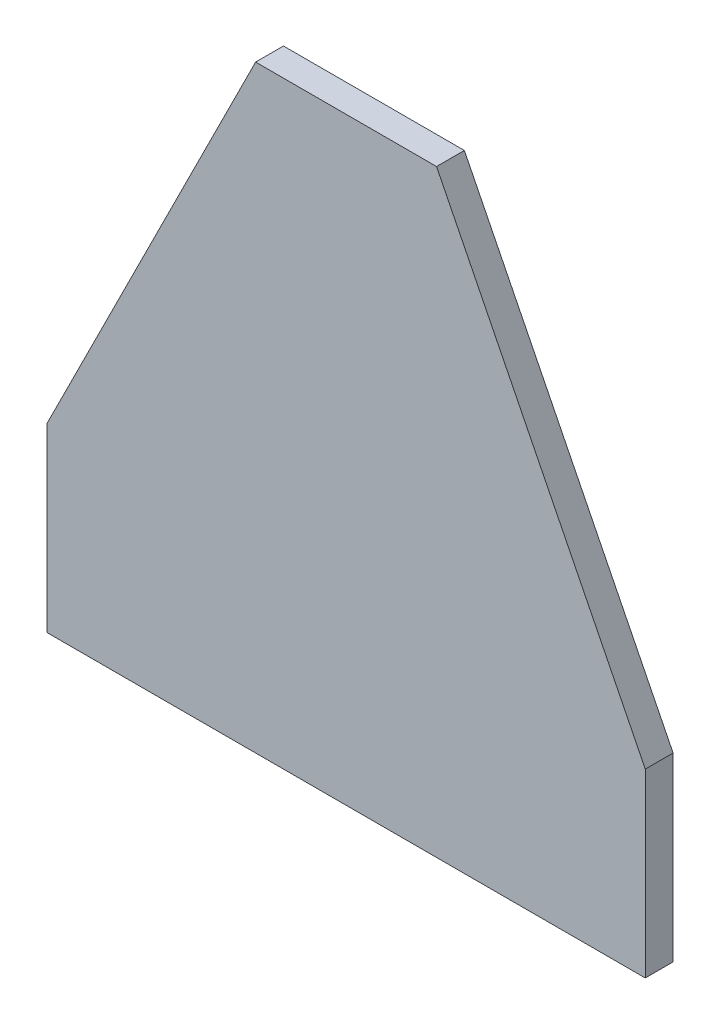
ISO-10303-21;
HEADER;
FILE_DESCRIPTION(('STEP AP214'),'2;1');
FILE_NAME('part.step','',(''),(''),'','','');
FILE_SCHEMA(('AUTOMOTIVE_DESIGN { 1 0 10303 214 1 1 1 1 }'));
ENDSEC;
DATA;
#1=APPLICATION_CONTEXT('core data for automotive mechanical design processes');
#2=APPLICATION_PROTOCOL_DEFINITION('international standard','automotive_design',2000,#1);
#3=PRODUCT_CONTEXT('',#1,'mechanical');
#4=PRODUCT('Part','Part','',(#3));
#5=PRODUCT_RELATED_PRODUCT_CATEGORY('part','',(#4));
#6=PRODUCT_DEFINITION_FORMATION('','',#4);
#7=PRODUCT_DEFINITION_CONTEXT('part definition',#1,'design');
#8=PRODUCT_DEFINITION('design','',#6,#7);
#9=PRODUCT_DEFINITION_SHAPE('','',#8);
#10=(LENGTH_UNIT() NAMED_UNIT(*) SI_UNIT(.MILLI.,.METRE.));
#11=(NAMED_UNIT(*) PLANE_ANGLE_UNIT() SI_UNIT($,.RADIAN.));
#12=(NAMED_UNIT(*) SI_UNIT($,.STERADIAN.) SOLID_ANGLE_UNIT());
#13=UNCERTAINTY_MEASURE_WITH_UNIT(LENGTH_MEASURE(1.E-05),#10,'distance_accuracy_value','');
#14=(GEOMETRIC_REPRESENTATION_CONTEXT(3) GLOBAL_UNCERTAINTY_ASSIGNED_CONTEXT((#13)) GLOBAL_UNIT_ASSIGNED_CONTEXT((#10,
#11,#12)) REPRESENTATION_CONTEXT('',''));
#15=CARTESIAN_POINT('',(0.,0.,0.));
#16=DIRECTION('',(0.,0.,1.));
#17=DIRECTION('',(1.,0.,0.));
#18=AXIS2_PLACEMENT_3D('',#15,#16,#17);
#19=CARTESIAN_POINT('',(-20.6375,0.,3.175));
#20=DIRECTION('',(0.,0.,-1.));
#21=DIRECTION('',(-1.,0.,0.));
#22=AXIS2_PLACEMENT_3D('',#19,#20,#21);
#23=PLANE('',#22);
#24=DIRECTION('',(-0.447213595499958,-0.894427190999916,0.));
#25=VECTOR('',#24,1.);
#26=CARTESIAN_POINT('',(-68.2625,-95.25,3.175));
#27=LINE('',#26,#25);
#28=CARTESIAN_POINT('',(-20.6375,0.,3.175));
#29=VERTEX_POINT('',#28);
#30=CARTESIAN_POINT('',(-68.2625,-95.25,3.175));
#31=VERTEX_POINT('',#30);
#32=EDGE_CURVE('E145',#29,#31,#27,.T.);
#33=ORIENTED_EDGE('',*,*,#32,.T.);
#34=DIRECTION('',(0.,-1.,0.));
#35=VECTOR('',#34,1.);
#36=CARTESIAN_POINT('',(-68.2625,-136.525,3.175));
#37=LINE('',#36,#35);
#38=CARTESIAN_POINT('',(-68.2625,-136.525,3.175));
#39=VERTEX_POINT('',#38);
#40=EDGE_CURVE('E95',#31,#39,#37,.T.);
#41=ORIENTED_EDGE('',*,*,#40,.T.);
#42=DIRECTION('',(1.,0.,0.));
#43=VECTOR('',#42,1.);
#44=CARTESIAN_POINT('',(68.2625,-136.525,3.175));
#45=LINE('',#44,#43);
#46=CARTESIAN_POINT('',(68.2625,-136.525,3.175));
#47=VERTEX_POINT('',#46);
#48=EDGE_CURVE('E107',#39,#47,#45,.T.);
#49=ORIENTED_EDGE('',*,*,#48,.T.);
#50=DIRECTION('',(0.,1.,0.));
#51=VECTOR('',#50,1.);
#52=CARTESIAN_POINT('',(68.2625,-95.25,3.175));
#53=LINE('',#52,#51);
#54=CARTESIAN_POINT('',(68.2625,-95.25,3.175));
#55=VERTEX_POINT('',#54);
#56=EDGE_CURVE('E102',#47,#55,#53,.T.);
#57=ORIENTED_EDGE('',*,*,#56,.T.);
#58=DIRECTION('',(-0.447213595499958,0.894427190999916,0.));
#59=VECTOR('',#58,1.);
#60=CARTESIAN_POINT('',(20.6375,0.,3.175));
#61=LINE('',#60,#59);
#62=CARTESIAN_POINT('',(20.6375,0.,3.175));
#63=VERTEX_POINT('',#62);
#64=EDGE_CURVE('E105',#55,#63,#61,.T.);
#65=ORIENTED_EDGE('',*,*,#64,.T.);
#66=DIRECTION('',(-1.,0.,0.));
#67=VECTOR('',#66,1.);
#68=CARTESIAN_POINT('',(-20.6375,0.,3.175));
#69=LINE('',#68,#67);
#70=EDGE_CURVE('E58',#63,#29,#69,.T.);
#71=ORIENTED_EDGE('',*,*,#70,.T.);
#72=EDGE_LOOP('',(#33,#41,#49,#57,#65,#71));
#73=FACE_BOUND('',#72,.T.);
#74=ADVANCED_FACE('F40',(#73),#23,.F.);
#75=CARTESIAN_POINT('',(-20.6375,0.,-3.175));
#76=DIRECTION('',(0.,0.,-1.));
#77=DIRECTION('',(-1.,0.,0.));
#78=AXIS2_PLACEMENT_3D('',#75,#76,#77);
#79=PLANE('',#78);
#80=DIRECTION('',(-0.447213595499958,-0.894427190999916,0.));
#81=VECTOR('',#80,1.);
#82=CARTESIAN_POINT('',(-68.2625,-95.25,-3.175));
#83=LINE('',#82,#81);
#84=CARTESIAN_POINT('',(-20.6375,0.,-3.175));
#85=VERTEX_POINT('',#84);
#86=CARTESIAN_POINT('',(-68.2625,-95.25,-3.175));
#87=VERTEX_POINT('',#86);
#88=EDGE_CURVE('E129',#85,#87,#83,.T.);
#89=ORIENTED_EDGE('',*,*,#88,.F.);
#90=DIRECTION('',(-1.,0.,0.));
#91=VECTOR('',#90,1.);
#92=CARTESIAN_POINT('',(-20.6375,0.,-3.175));
#93=LINE('',#92,#91);
#94=CARTESIAN_POINT('',(20.6375,0.,-3.175));
#95=VERTEX_POINT('',#94);
#96=EDGE_CURVE('E87',#95,#85,#93,.T.);
#97=ORIENTED_EDGE('',*,*,#96,.F.);
#98=DIRECTION('',(-0.447213595499958,0.894427190999916,0.));
#99=VECTOR('',#98,1.);
#100=CARTESIAN_POINT('',(20.6375,0.,-3.175));
#101=LINE('',#100,#99);
#102=CARTESIAN_POINT('',(68.2625,-95.25,-3.175));
#103=VERTEX_POINT('',#102);
#104=EDGE_CURVE('E81',#103,#95,#101,.T.);
#105=ORIENTED_EDGE('',*,*,#104,.F.);
#106=DIRECTION('',(0.,1.,0.));
#107=VECTOR('',#106,1.);
#108=CARTESIAN_POINT('',(68.2625,-95.25,-3.175));
#109=LINE('',#108,#107);
#110=CARTESIAN_POINT('',(68.2625,-136.525,-3.175));
#111=VERTEX_POINT('',#110);
#112=EDGE_CURVE('E116',#111,#103,#109,.T.);
#113=ORIENTED_EDGE('',*,*,#112,.F.);
#114=DIRECTION('',(1.,0.,0.));
#115=VECTOR('',#114,1.);
#116=CARTESIAN_POINT('',(68.2625,-136.525,-3.175));
#117=LINE('',#116,#115);
#118=CARTESIAN_POINT('',(-68.2625,-136.525,-3.175));
#119=VERTEX_POINT('',#118);
#120=EDGE_CURVE('E136',#119,#111,#117,.T.);
#121=ORIENTED_EDGE('',*,*,#120,.F.);
#122=DIRECTION('',(0.,-1.,0.));
#123=VECTOR('',#122,1.);
#124=CARTESIAN_POINT('',(-68.2625,-136.525,-3.175));
#125=LINE('',#124,#123);
#126=EDGE_CURVE('E133',#87,#119,#125,.T.);
#127=ORIENTED_EDGE('',*,*,#126,.F.);
#128=EDGE_LOOP('',(#89,#97,#105,#113,#121,#127));
#129=FACE_BOUND('',#128,.T.);
#130=ADVANCED_FACE('F158',(#129),#79,.T.);
#131=CARTESIAN_POINT('',(-68.2625,-95.25,3.175));
#132=DIRECTION('',(0.894427190999916,-0.447213595499958,0.));
#133=DIRECTION('',(0.447213595499958,0.894427190999916,0.));
#134=AXIS2_PLACEMENT_3D('',#131,#132,#133);
#135=PLANE('',#134);
#136=ORIENTED_EDGE('',*,*,#88,.T.);
#137=DIRECTION('',(0.,0.,-1.));
#138=VECTOR('',#137,1.);
#139=CARTESIAN_POINT('',(-68.2625,-95.25,3.175));
#140=LINE('',#139,#138);
#141=EDGE_CURVE('E11',#31,#87,#140,.T.);
#142=ORIENTED_EDGE('',*,*,#141,.F.);
#143=ORIENTED_EDGE('',*,*,#32,.F.);
#144=DIRECTION('',(0.,0.,-1.));
#145=VECTOR('',#144,1.);
#146=CARTESIAN_POINT('',(-20.6375,0.,3.175));
#147=LINE('',#146,#145);
#148=EDGE_CURVE('E125',#29,#85,#147,.T.);
#149=ORIENTED_EDGE('',*,*,#148,.T.);
#150=EDGE_LOOP('',(#136,#142,#143,#149));
#151=FACE_BOUND('',#150,.T.);
#152=ADVANCED_FACE('F42',(#151),#135,.F.);
#153=CARTESIAN_POINT('',(-68.2625,-136.525,3.175));
#154=DIRECTION('',(1.,0.,0.));
#155=DIRECTION('',(0.,0.,-1.));
#156=AXIS2_PLACEMENT_3D('',#153,#154,#155);
#157=PLANE('',#156);
#158=ORIENTED_EDGE('',*,*,#126,.T.);
#159=DIRECTION('',(0.,0.,-1.));
#160=VECTOR('',#159,1.);
#161=CARTESIAN_POINT('',(-68.2625,-136.525,3.175));
#162=LINE('',#161,#160);
#163=EDGE_CURVE('E50',#39,#119,#162,.T.);
#164=ORIENTED_EDGE('',*,*,#163,.F.);
#165=ORIENTED_EDGE('',*,*,#40,.F.);
#166=ORIENTED_EDGE('',*,*,#141,.T.);
#167=EDGE_LOOP('',(#158,#164,#165,#166));
#168=FACE_BOUND('',#167,.T.);
#169=ADVANCED_FACE('F178',(#168),#157,.F.);
#170=CARTESIAN_POINT('',(68.2625,-136.525,3.175));
#171=DIRECTION('',(0.,1.,0.));
#172=DIRECTION('',(0.,0.,1.));
#173=AXIS2_PLACEMENT_3D('',#170,#171,#172);
#174=PLANE('',#173);
#175=ORIENTED_EDGE('',*,*,#120,.T.);
#176=DIRECTION('',(0.,0.,-1.));
#177=VECTOR('',#176,1.);
#178=CARTESIAN_POINT('',(68.2625,-136.525,3.175));
#179=LINE('',#178,#177);
#180=EDGE_CURVE('E118',#47,#111,#179,.T.);
#181=ORIENTED_EDGE('',*,*,#180,.F.);
#182=ORIENTED_EDGE('',*,*,#48,.F.);
#183=ORIENTED_EDGE('',*,*,#163,.T.);
#184=EDGE_LOOP('',(#175,#181,#182,#183));
#185=FACE_BOUND('',#184,.T.);
#186=ADVANCED_FACE('F155',(#185),#174,.F.);
#187=CARTESIAN_POINT('',(68.2625,-95.25,3.175));
#188=DIRECTION('',(-1.,0.,0.));
#189=DIRECTION('',(0.,-1.,0.));
#190=AXIS2_PLACEMENT_3D('',#187,#188,#189);
#191=PLANE('',#190);
#192=ORIENTED_EDGE('',*,*,#112,.T.);
#193=DIRECTION('',(0.,0.,-1.));
#194=VECTOR('',#193,1.);
#195=CARTESIAN_POINT('',(68.2625,-95.25,3.175));
#196=LINE('',#195,#194);
#197=EDGE_CURVE('E113',#55,#103,#196,.T.);
#198=ORIENTED_EDGE('',*,*,#197,.F.);
#199=ORIENTED_EDGE('',*,*,#56,.F.);
#200=ORIENTED_EDGE('',*,*,#180,.T.);
#201=EDGE_LOOP('',(#192,#198,#199,#200));
#202=FACE_BOUND('',#201,.T.);
#203=ADVANCED_FACE('F114',(#202),#191,.F.);
#204=CARTESIAN_POINT('',(20.6375,0.,3.175));
#205=DIRECTION('',(-0.894427190999916,-0.447213595499958,0.));
#206=DIRECTION('',(0.447213595499958,-0.894427190999916,0.));
#207=AXIS2_PLACEMENT_3D('',#204,#205,#206);
#208=PLANE('',#207);
#209=ORIENTED_EDGE('',*,*,#104,.T.);
#210=DIRECTION('',(0.,0.,-1.));
#211=VECTOR('',#210,1.);
#212=CARTESIAN_POINT('',(20.6375,0.,3.175));
#213=LINE('',#212,#211);
#214=EDGE_CURVE('E119',#63,#95,#213,.T.);
#215=ORIENTED_EDGE('',*,*,#214,.F.);
#216=ORIENTED_EDGE('',*,*,#64,.F.);
#217=ORIENTED_EDGE('',*,*,#197,.T.);
#218=EDGE_LOOP('',(#209,#215,#216,#217));
#219=FACE_BOUND('',#218,.T.);
#220=ADVANCED_FACE('F121',(#219),#208,.F.);
#221=CARTESIAN_POINT('',(-20.6375,0.,3.175));
#222=DIRECTION('',(0.,-1.,0.));
#223=DIRECTION('',(0.,0.,-1.));
#224=AXIS2_PLACEMENT_3D('',#221,#222,#223);
#225=PLANE('',#224);
#226=ORIENTED_EDGE('',*,*,#96,.T.);
#227=ORIENTED_EDGE('',*,*,#148,.F.);
#228=ORIENTED_EDGE('',*,*,#70,.F.);
#229=ORIENTED_EDGE('',*,*,#214,.T.);
#230=EDGE_LOOP('',(#226,#227,#228,#229));
#231=FACE_BOUND('',#230,.T.);
#232=ADVANCED_FACE('F162',(#231),#225,.F.);
#233=CLOSED_SHELL('',(#74,#130,#152,#169,#186,#203,#220,#232));
#234=MANIFOLD_SOLID_BREP('B2',#233);
#235=ADVANCED_BREP_SHAPE_REPRESENTATION('',(#18,#234),#14);
#236=SHAPE_DEFINITION_REPRESENTATION(#9,#235);
ENDSEC;
END-ISO-10303-21;
